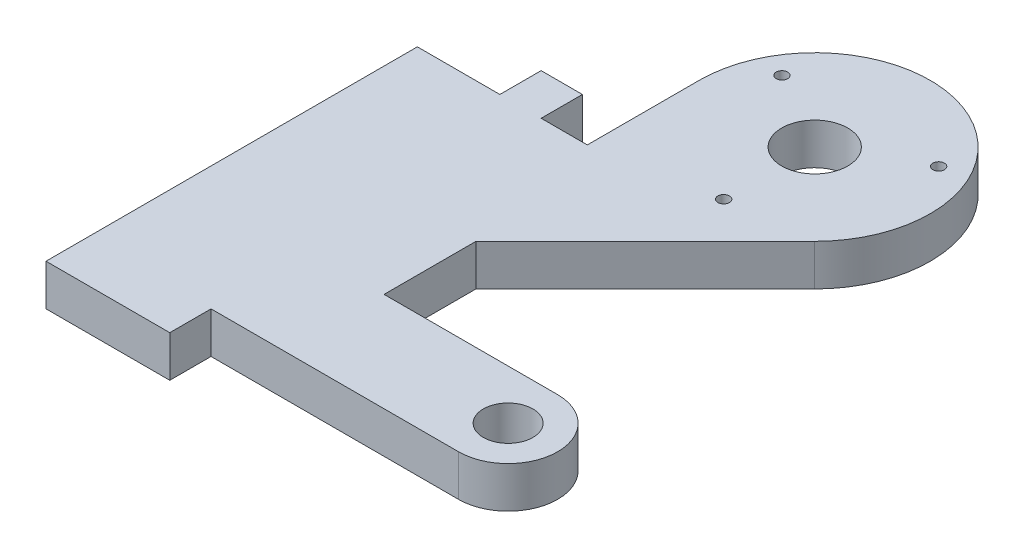
ISO-10303-21;
HEADER;
FILE_DESCRIPTION(('STEP AP214'),'2;1');
FILE_NAME('part.step','',(''),(''),'','','');
FILE_SCHEMA(('AUTOMOTIVE_DESIGN { 1 0 10303 214 1 1 1 1 }'));
ENDSEC;
DATA;
#1=APPLICATION_CONTEXT('core data for automotive mechanical design processes');
#2=APPLICATION_PROTOCOL_DEFINITION('international standard','automotive_design',2000,#1);
#3=PRODUCT_CONTEXT('',#1,'mechanical');
#4=PRODUCT('Part','Part','',(#3));
#5=PRODUCT_RELATED_PRODUCT_CATEGORY('part','',(#4));
#6=PRODUCT_DEFINITION_FORMATION('','',#4);
#7=PRODUCT_DEFINITION_CONTEXT('part definition',#1,'design');
#8=PRODUCT_DEFINITION('design','',#6,#7);
#9=PRODUCT_DEFINITION_SHAPE('','',#8);
#10=(LENGTH_UNIT() NAMED_UNIT(*) SI_UNIT(.MILLI.,.METRE.));
#11=(NAMED_UNIT(*) PLANE_ANGLE_UNIT() SI_UNIT($,.RADIAN.));
#12=(NAMED_UNIT(*) SI_UNIT($,.STERADIAN.) SOLID_ANGLE_UNIT());
#13=UNCERTAINTY_MEASURE_WITH_UNIT(LENGTH_MEASURE(1.E-05),#10,'distance_accuracy_value','');
#14=(GEOMETRIC_REPRESENTATION_CONTEXT(3) GLOBAL_UNCERTAINTY_ASSIGNED_CONTEXT((#13)) GLOBAL_UNIT_ASSIGNED_CONTEXT((#10,
#11,#12)) REPRESENTATION_CONTEXT('',''));
#15=CARTESIAN_POINT('',(0.,0.,0.));
#16=DIRECTION('',(0.,0.,1.));
#17=DIRECTION('',(1.,0.,0.));
#18=AXIS2_PLACEMENT_3D('',#15,#16,#17);
#19=CARTESIAN_POINT('',(34.5943867597462,5.,-53.5625469181819));
#20=DIRECTION('',(0.,-1.,0.));
#21=DIRECTION('',(0.,0.,-1.));
#22=AXIS2_PLACEMENT_3D('',#19,#20,#21);
#23=CYLINDRICAL_SURFACE('',#22,14.);
#24=CARTESIAN_POINT('',(34.5943867597462,0.,-53.5625469181819));
#25=DIRECTION('',(0.,1.,0.));
#26=DIRECTION('',(0.,0.,1.));
#27=AXIS2_PLACEMENT_3D('',#24,#25,#26);
#28=CIRCLE('',#27,14.);
#29=CARTESIAN_POINT('',(44.4938816963578,0.,-43.6630519815702));
#30=VERTEX_POINT('',#29);
#31=CARTESIAN_POINT('',(20.5943867597462,0.,-53.5625469181819));
#32=VERTEX_POINT('',#31);
#33=EDGE_CURVE('E207',#30,#32,#28,.T.);
#34=ORIENTED_EDGE('',*,*,#33,.T.);
#35=DIRECTION('',(0.,-1.,0.));
#36=VECTOR('',#35,1.);
#37=CARTESIAN_POINT('',(20.5943867597462,5.,-53.5625469181819));
#38=LINE('',#37,#36);
#39=CARTESIAN_POINT('',(20.5943867597462,5.,-53.5625469181819));
#40=VERTEX_POINT('',#39);
#41=EDGE_CURVE('E11',#40,#32,#38,.T.);
#42=ORIENTED_EDGE('',*,*,#41,.F.);
#43=CARTESIAN_POINT('',(34.5943867597462,5.,-53.5625469181819));
#44=DIRECTION('',(0.,1.,0.));
#45=DIRECTION('',(0.,0.,1.));
#46=AXIS2_PLACEMENT_3D('',#43,#44,#45);
#47=CIRCLE('',#46,14.);
#48=CARTESIAN_POINT('',(44.4938816963578,5.,-43.6630519815702));
#49=VERTEX_POINT('',#48);
#50=EDGE_CURVE('E353',#49,#40,#47,.T.);
#51=ORIENTED_EDGE('',*,*,#50,.F.);
#52=DIRECTION('',(0.,-1.,0.));
#53=VECTOR('',#52,1.);
#54=CARTESIAN_POINT('',(44.4938816963578,5.,-43.6630519815702));
#55=LINE('',#54,#53);
#56=EDGE_CURVE('E59',#49,#30,#55,.T.);
#57=ORIENTED_EDGE('',*,*,#56,.T.);
#58=EDGE_LOOP('',(#34,#42,#51,#57));
#59=FACE_BOUND('',#58,.T.);
#60=ADVANCED_FACE('F41',(#59),#23,.T.);
#61=CARTESIAN_POINT('',(20.5943867597462,5.,0.));
#62=DIRECTION('',(1.,0.,0.));
#63=DIRECTION('',(0.,0.,-1.));
#64=AXIS2_PLACEMENT_3D('',#61,#62,#63);
#65=PLANE('',#64);
#66=DIRECTION('',(0.,0.,1.));
#67=VECTOR('',#66,1.);
#68=CARTESIAN_POINT('',(20.5943867597462,0.,0.));
#69=LINE('',#68,#67);
#70=CARTESIAN_POINT('',(20.5943867597462,0.,-40.));
#71=VERTEX_POINT('',#70);
#72=EDGE_CURVE('E210',#32,#71,#69,.T.);
#73=ORIENTED_EDGE('',*,*,#72,.T.);
#74=DIRECTION('',(0.,-1.,0.));
#75=VECTOR('',#74,1.);
#76=CARTESIAN_POINT('',(20.5943867597462,5.,-40.));
#77=LINE('',#76,#75);
#78=CARTESIAN_POINT('',(20.5943867597462,5.,-40.));
#79=VERTEX_POINT('',#78);
#80=EDGE_CURVE('E51',#79,#71,#77,.T.);
#81=ORIENTED_EDGE('',*,*,#80,.F.);
#82=DIRECTION('',(0.,0.,1.));
#83=VECTOR('',#82,1.);
#84=CARTESIAN_POINT('',(20.5943867597462,5.,0.));
#85=LINE('',#84,#83);
#86=EDGE_CURVE('E119',#40,#79,#85,.T.);
#87=ORIENTED_EDGE('',*,*,#86,.F.);
#88=ORIENTED_EDGE('',*,*,#41,.T.);
#89=EDGE_LOOP('',(#73,#81,#87,#88));
#90=FACE_BOUND('',#89,.T.);
#91=ADVANCED_FACE('F303',(#90),#65,.F.);
#92=CARTESIAN_POINT('',(0.,5.,-40.));
#93=DIRECTION('',(0.,0.,-1.));
#94=DIRECTION('',(-1.,0.,0.));
#95=AXIS2_PLACEMENT_3D('',#92,#93,#94);
#96=PLANE('',#95);
#97=DIRECTION('',(1.,0.,0.));
#98=VECTOR('',#97,1.);
#99=CARTESIAN_POINT('',(0.,0.,-40.));
#100=LINE('',#99,#98);
#101=CARTESIAN_POINT('',(15.,0.,-40.));
#102=VERTEX_POINT('',#101);
#103=EDGE_CURVE('E214',#102,#71,#100,.T.);
#104=ORIENTED_EDGE('',*,*,#103,.F.);
#105=DIRECTION('',(0.,-1.,0.));
#106=VECTOR('',#105,1.);
#107=CARTESIAN_POINT('',(15.,5.,-40.));
#108=LINE('',#107,#106);
#109=CARTESIAN_POINT('',(15.,5.,-40.));
#110=VERTEX_POINT('',#109);
#111=EDGE_CURVE('E294',#110,#102,#108,.T.);
#112=ORIENTED_EDGE('',*,*,#111,.F.);
#113=DIRECTION('',(1.,0.,0.));
#114=VECTOR('',#113,1.);
#115=CARTESIAN_POINT('',(0.,5.,-40.));
#116=LINE('',#115,#114);
#117=EDGE_CURVE('E302',#110,#79,#116,.T.);
#118=ORIENTED_EDGE('',*,*,#117,.T.);
#119=ORIENTED_EDGE('',*,*,#80,.T.);
#120=EDGE_LOOP('',(#104,#112,#118,#119));
#121=FACE_BOUND('',#120,.T.);
#122=ADVANCED_FACE('F300',(#121),#96,.T.);
#123=CARTESIAN_POINT('',(15.,5.,0.));
#124=DIRECTION('',(-1.,0.,0.));
#125=DIRECTION('',(0.,0.,1.));
#126=AXIS2_PLACEMENT_3D('',#123,#124,#125);
#127=PLANE('',#126);
#128=DIRECTION('',(0.,0.,-1.));
#129=VECTOR('',#128,1.);
#130=CARTESIAN_POINT('',(15.,0.,0.));
#131=LINE('',#130,#129);
#132=CARTESIAN_POINT('',(15.,0.,-45.));
#133=VERTEX_POINT('',#132);
#134=EDGE_CURVE('E218',#102,#133,#131,.T.);
#135=ORIENTED_EDGE('',*,*,#134,.T.);
#136=DIRECTION('',(0.,-1.,0.));
#137=VECTOR('',#136,1.);
#138=CARTESIAN_POINT('',(15.,5.,-45.));
#139=LINE('',#138,#137);
#140=CARTESIAN_POINT('',(15.,5.,-45.));
#141=VERTEX_POINT('',#140);
#142=EDGE_CURVE('E290',#141,#133,#139,.T.);
#143=ORIENTED_EDGE('',*,*,#142,.F.);
#144=DIRECTION('',(0.,0.,-1.));
#145=VECTOR('',#144,1.);
#146=CARTESIAN_POINT('',(15.,5.,0.));
#147=LINE('',#146,#145);
#148=EDGE_CURVE('E323',#110,#141,#147,.T.);
#149=ORIENTED_EDGE('',*,*,#148,.F.);
#150=ORIENTED_EDGE('',*,*,#111,.T.);
#151=EDGE_LOOP('',(#135,#143,#149,#150));
#152=FACE_BOUND('',#151,.T.);
#153=ADVANCED_FACE('F312',(#152),#127,.F.);
#154=CARTESIAN_POINT('',(0.,5.,-45.));
#155=DIRECTION('',(0.,0.,1.));
#156=DIRECTION('',(1.,0.,0.));
#157=AXIS2_PLACEMENT_3D('',#154,#155,#156);
#158=PLANE('',#157);
#159=DIRECTION('',(-1.,0.,0.));
#160=VECTOR('',#159,1.);
#161=CARTESIAN_POINT('',(0.,0.,-45.));
#162=LINE('',#161,#160);
#163=CARTESIAN_POINT('',(9.99999999999999,0.,-45.));
#164=VERTEX_POINT('',#163);
#165=EDGE_CURVE('E222',#133,#164,#162,.T.);
#166=ORIENTED_EDGE('',*,*,#165,.T.);
#167=DIRECTION('',(0.,-1.,0.));
#168=VECTOR('',#167,1.);
#169=CARTESIAN_POINT('',(9.99999999999999,5.,-45.));
#170=LINE('',#169,#168);
#171=CARTESIAN_POINT('',(9.99999999999999,5.,-45.));
#172=VERTEX_POINT('',#171);
#173=EDGE_CURVE('E287',#172,#164,#170,.T.);
#174=ORIENTED_EDGE('',*,*,#173,.F.);
#175=DIRECTION('',(-1.,0.,0.));
#176=VECTOR('',#175,1.);
#177=CARTESIAN_POINT('',(0.,5.,-45.));
#178=LINE('',#177,#176);
#179=EDGE_CURVE('E318',#141,#172,#178,.T.);
#180=ORIENTED_EDGE('',*,*,#179,.F.);
#181=ORIENTED_EDGE('',*,*,#142,.T.);
#182=EDGE_LOOP('',(#166,#174,#180,#181));
#183=FACE_BOUND('',#182,.T.);
#184=ADVANCED_FACE('F316',(#183),#158,.F.);
#185=CARTESIAN_POINT('',(10.,5.,0.));
#186=DIRECTION('',(-1.,0.,0.));
#187=DIRECTION('',(0.,0.,1.));
#188=AXIS2_PLACEMENT_3D('',#185,#186,#187);
#189=PLANE('',#188);
#190=DIRECTION('',(0.,0.,-1.));
#191=VECTOR('',#190,1.);
#192=CARTESIAN_POINT('',(10.,0.,0.));
#193=LINE('',#192,#191);
#194=CARTESIAN_POINT('',(10.,0.,-40.));
#195=VERTEX_POINT('',#194);
#196=EDGE_CURVE('E226',#195,#164,#193,.T.);
#197=ORIENTED_EDGE('',*,*,#196,.F.);
#198=DIRECTION('',(0.,-1.,0.));
#199=VECTOR('',#198,1.);
#200=CARTESIAN_POINT('',(10.,5.,-40.));
#201=LINE('',#200,#199);
#202=CARTESIAN_POINT('',(10.,5.,-40.));
#203=VERTEX_POINT('',#202);
#204=EDGE_CURVE('E284',#203,#195,#201,.T.);
#205=ORIENTED_EDGE('',*,*,#204,.F.);
#206=DIRECTION('',(0.,0.,-1.));
#207=VECTOR('',#206,1.);
#208=CARTESIAN_POINT('',(10.,5.,0.));
#209=LINE('',#208,#207);
#210=EDGE_CURVE('E322',#203,#172,#209,.T.);
#211=ORIENTED_EDGE('',*,*,#210,.T.);
#212=ORIENTED_EDGE('',*,*,#173,.T.);
#213=EDGE_LOOP('',(#197,#205,#211,#212));
#214=FACE_BOUND('',#213,.T.);
#215=ADVANCED_FACE('F458',(#214),#189,.T.);
#216=CARTESIAN_POINT('',(0.,0.,-40.));
#217=VERTEX_POINT('',#216);
#218=EDGE_CURVE('E219',#217,#195,#100,.T.);
#219=ORIENTED_EDGE('',*,*,#218,.F.);
#220=DIRECTION('',(0.,-1.,0.));
#221=VECTOR('',#220,1.);
#222=CARTESIAN_POINT('',(0.,5.,-40.));
#223=LINE('',#222,#221);
#224=CARTESIAN_POINT('',(0.,5.,-40.));
#225=VERTEX_POINT('',#224);
#226=EDGE_CURVE('E281',#225,#217,#223,.T.);
#227=ORIENTED_EDGE('',*,*,#226,.F.);
#228=EDGE_CURVE('E327',#225,#203,#116,.T.);
#229=ORIENTED_EDGE('',*,*,#228,.T.);
#230=ORIENTED_EDGE('',*,*,#204,.T.);
#231=EDGE_LOOP('',(#219,#227,#229,#230));
#232=FACE_BOUND('',#231,.T.);
#233=ADVANCED_FACE('F454',(#232),#96,.T.);
#234=CARTESIAN_POINT('',(0.,5.,0.));
#235=DIRECTION('',(-1.,0.,0.));
#236=DIRECTION('',(0.,0.,1.));
#237=AXIS2_PLACEMENT_3D('',#234,#235,#236);
#238=PLANE('',#237);
#239=DIRECTION('',(0.,0.,-1.));
#240=VECTOR('',#239,1.);
#241=CARTESIAN_POINT('',(0.,0.,0.));
#242=LINE('',#241,#240);
#243=CARTESIAN_POINT('',(0.,0.,5.));
#244=VERTEX_POINT('',#243);
#245=EDGE_CURVE('E230',#244,#217,#242,.T.);
#246=ORIENTED_EDGE('',*,*,#245,.F.);
#247=DIRECTION('',(0.,-1.,0.));
#248=VECTOR('',#247,1.);
#249=CARTESIAN_POINT('',(0.,5.,5.));
#250=LINE('',#249,#248);
#251=CARTESIAN_POINT('',(0.,5.,5.));
#252=VERTEX_POINT('',#251);
#253=EDGE_CURVE('E278',#252,#244,#250,.T.);
#254=ORIENTED_EDGE('',*,*,#253,.F.);
#255=DIRECTION('',(0.,0.,-1.));
#256=VECTOR('',#255,1.);
#257=CARTESIAN_POINT('',(0.,5.,0.));
#258=LINE('',#257,#256);
#259=EDGE_CURVE('E332',#252,#225,#258,.T.);
#260=ORIENTED_EDGE('',*,*,#259,.T.);
#261=ORIENTED_EDGE('',*,*,#226,.T.);
#262=EDGE_LOOP('',(#246,#254,#260,#261));
#263=FACE_BOUND('',#262,.T.);
#264=ADVANCED_FACE('F450',(#263),#238,.T.);
#265=CARTESIAN_POINT('',(0.,5.,5.));
#266=DIRECTION('',(0.,0.,-1.));
#267=DIRECTION('',(-1.,0.,0.));
#268=AXIS2_PLACEMENT_3D('',#265,#266,#267);
#269=PLANE('',#268);
#270=DIRECTION('',(1.,0.,0.));
#271=VECTOR('',#270,1.);
#272=CARTESIAN_POINT('',(0.,0.,5.));
#273=LINE('',#272,#271);
#274=CARTESIAN_POINT('',(15.,0.,5.));
#275=VERTEX_POINT('',#274);
#276=EDGE_CURVE('E234',#244,#275,#273,.T.);
#277=ORIENTED_EDGE('',*,*,#276,.T.);
#278=DIRECTION('',(0.,-1.,0.));
#279=VECTOR('',#278,1.);
#280=CARTESIAN_POINT('',(15.,5.,5.));
#281=LINE('',#280,#279);
#282=CARTESIAN_POINT('',(15.,5.,5.));
#283=VERTEX_POINT('',#282);
#284=EDGE_CURVE('E275',#283,#275,#281,.T.);
#285=ORIENTED_EDGE('',*,*,#284,.F.);
#286=DIRECTION('',(1.,0.,0.));
#287=VECTOR('',#286,1.);
#288=CARTESIAN_POINT('',(0.,5.,5.));
#289=LINE('',#288,#287);
#290=EDGE_CURVE('E336',#252,#283,#289,.T.);
#291=ORIENTED_EDGE('',*,*,#290,.F.);
#292=ORIENTED_EDGE('',*,*,#253,.T.);
#293=EDGE_LOOP('',(#277,#285,#291,#292));
#294=FACE_BOUND('',#293,.T.);
#295=ADVANCED_FACE('F446',(#294),#269,.F.);
#296=CARTESIAN_POINT('',(15.,5.,0.));
#297=DIRECTION('',(1.,0.,0.));
#298=DIRECTION('',(0.,0.,-1.));
#299=AXIS2_PLACEMENT_3D('',#296,#297,#298);
#300=PLANE('',#299);
#301=DIRECTION('',(0.,0.,1.));
#302=VECTOR('',#301,1.);
#303=CARTESIAN_POINT('',(15.,0.,0.));
#304=LINE('',#303,#302);
#305=CARTESIAN_POINT('',(15.,0.,0.));
#306=VERTEX_POINT('',#305);
#307=EDGE_CURVE('E238',#306,#275,#304,.T.);
#308=ORIENTED_EDGE('',*,*,#307,.F.);
#309=DIRECTION('',(0.,-1.,0.));
#310=VECTOR('',#309,1.);
#311=CARTESIAN_POINT('',(15.,5.,0.));
#312=LINE('',#311,#310);
#313=CARTESIAN_POINT('',(15.,5.,0.));
#314=VERTEX_POINT('',#313);
#315=EDGE_CURVE('E272',#314,#306,#312,.T.);
#316=ORIENTED_EDGE('',*,*,#315,.F.);
#317=DIRECTION('',(0.,0.,1.));
#318=VECTOR('',#317,1.);
#319=CARTESIAN_POINT('',(15.,5.,0.));
#320=LINE('',#319,#318);
#321=EDGE_CURVE('E339',#314,#283,#320,.T.);
#322=ORIENTED_EDGE('',*,*,#321,.T.);
#323=ORIENTED_EDGE('',*,*,#284,.T.);
#324=EDGE_LOOP('',(#308,#316,#322,#323));
#325=FACE_BOUND('',#324,.T.);
#326=ADVANCED_FACE('F442',(#325),#300,.T.);
#327=CARTESIAN_POINT('',(0.,5.,0.));
#328=DIRECTION('',(0.,0.,-1.));
#329=DIRECTION('',(-1.,0.,0.));
#330=AXIS2_PLACEMENT_3D('',#327,#328,#329);
#331=PLANE('',#330);
#332=DIRECTION('',(1.,0.,0.));
#333=VECTOR('',#332,1.);
#334=CARTESIAN_POINT('',(0.,0.,0.));
#335=LINE('',#334,#333);
#336=CARTESIAN_POINT('',(45.,0.,0.));
#337=VERTEX_POINT('',#336);
#338=EDGE_CURVE('E242',#306,#337,#335,.T.);
#339=ORIENTED_EDGE('',*,*,#338,.T.);
#340=DIRECTION('',(0.,-1.,0.));
#341=VECTOR('',#340,1.);
#342=CARTESIAN_POINT('',(45.,5.,0.));
#343=LINE('',#342,#341);
#344=CARTESIAN_POINT('',(45.,5.,0.));
#345=VERTEX_POINT('',#344);
#346=EDGE_CURVE('E268',#345,#337,#343,.T.);
#347=ORIENTED_EDGE('',*,*,#346,.F.);
#348=DIRECTION('',(1.,0.,0.));
#349=VECTOR('',#348,1.);
#350=CARTESIAN_POINT('',(0.,5.,0.));
#351=LINE('',#350,#349);
#352=EDGE_CURVE('E343',#314,#345,#351,.T.);
#353=ORIENTED_EDGE('',*,*,#352,.F.);
#354=ORIENTED_EDGE('',*,*,#315,.T.);
#355=EDGE_LOOP('',(#339,#347,#353,#354));
#356=FACE_BOUND('',#355,.T.);
#357=ADVANCED_FACE('F438',(#356),#331,.F.);
#358=CARTESIAN_POINT('',(45.,5.,-6.));
#359=DIRECTION('',(0.,-1.,0.));
#360=DIRECTION('',(0.,0.,-1.));
#361=AXIS2_PLACEMENT_3D('',#358,#359,#360);
#362=CYLINDRICAL_SURFACE('',#361,6.);
#363=CARTESIAN_POINT('',(45.,0.,-6.));
#364=DIRECTION('',(0.,1.,0.));
#365=DIRECTION('',(0.,0.,1.));
#366=AXIS2_PLACEMENT_3D('',#363,#364,#365);
#367=CIRCLE('',#366,6.);
#368=CARTESIAN_POINT('',(45.,0.,-12.));
#369=VERTEX_POINT('',#368);
#370=EDGE_CURVE('E245',#337,#369,#367,.T.);
#371=ORIENTED_EDGE('',*,*,#370,.T.);
#372=DIRECTION('',(0.,-1.,0.));
#373=VECTOR('',#372,1.);
#374=CARTESIAN_POINT('',(45.,5.,-12.));
#375=LINE('',#374,#373);
#376=CARTESIAN_POINT('',(45.,5.,-12.));
#377=VERTEX_POINT('',#376);
#378=EDGE_CURVE('E177',#377,#369,#375,.T.);
#379=ORIENTED_EDGE('',*,*,#378,.F.);
#380=CARTESIAN_POINT('',(45.,5.,-6.));
#381=DIRECTION('',(0.,1.,0.));
#382=DIRECTION('',(0.,0.,1.));
#383=AXIS2_PLACEMENT_3D('',#380,#381,#382);
#384=CIRCLE('',#383,6.);
#385=EDGE_CURVE('E163',#345,#377,#384,.T.);
#386=ORIENTED_EDGE('',*,*,#385,.F.);
#387=ORIENTED_EDGE('',*,*,#346,.T.);
#388=EDGE_LOOP('',(#371,#379,#386,#387));
#389=FACE_BOUND('',#388,.T.);
#390=ADVANCED_FACE('F435',(#389),#362,.T.);
#391=CARTESIAN_POINT('',(0.,5.,-12.));
#392=DIRECTION('',(0.,0.,1.));
#393=DIRECTION('',(1.,0.,0.));
#394=AXIS2_PLACEMENT_3D('',#391,#392,#393);
#395=PLANE('',#394);
#396=DIRECTION('',(-1.,0.,0.));
#397=VECTOR('',#396,1.);
#398=CARTESIAN_POINT('',(0.,0.,-12.));
#399=LINE('',#398,#397);
#400=CARTESIAN_POINT('',(23.9647394168679,0.,-12.));
#401=VERTEX_POINT('',#400);
#402=EDGE_CURVE('E173',#369,#401,#399,.T.);
#403=ORIENTED_EDGE('',*,*,#402,.T.);
#404=DIRECTION('',(0.,-1.,0.));
#405=VECTOR('',#404,1.);
#406=CARTESIAN_POINT('',(23.9647394168679,5.,-12.));
#407=LINE('',#406,#405);
#408=CARTESIAN_POINT('',(23.9647394168679,5.,-12.));
#409=VERTEX_POINT('',#408);
#410=EDGE_CURVE('E170',#409,#401,#407,.T.);
#411=ORIENTED_EDGE('',*,*,#410,.F.);
#412=DIRECTION('',(-1.,0.,0.));
#413=VECTOR('',#412,1.);
#414=CARTESIAN_POINT('',(0.,5.,-12.));
#415=LINE('',#414,#413);
#416=EDGE_CURVE('E155',#377,#409,#415,.T.);
#417=ORIENTED_EDGE('',*,*,#416,.F.);
#418=ORIENTED_EDGE('',*,*,#378,.T.);
#419=EDGE_LOOP('',(#403,#411,#417,#418));
#420=FACE_BOUND('',#419,.T.);
#421=ADVANCED_FACE('F171',(#420),#395,.F.);
#422=CARTESIAN_POINT('',(23.9647394168679,5.,0.));
#423=DIRECTION('',(-1.,0.,0.));
#424=DIRECTION('',(0.,0.,1.));
#425=AXIS2_PLACEMENT_3D('',#422,#423,#424);
#426=PLANE('',#425);
#427=DIRECTION('',(0.,0.,-1.));
#428=VECTOR('',#427,1.);
#429=CARTESIAN_POINT('',(23.9647394168679,0.,0.));
#430=LINE('',#429,#428);
#431=CARTESIAN_POINT('',(23.9647394168679,0.,-23.1339097020804));
#432=VERTEX_POINT('',#431);
#433=EDGE_CURVE('E250',#401,#432,#430,.T.);
#434=ORIENTED_EDGE('',*,*,#433,.T.);
#435=DIRECTION('',(0.,-1.,0.));
#436=VECTOR('',#435,1.);
#437=CARTESIAN_POINT('',(23.9647394168679,5.,-23.1339097020804));
#438=LINE('',#437,#436);
#439=CARTESIAN_POINT('',(23.9647394168679,5.,-23.1339097020804));
#440=VERTEX_POINT('',#439);
#441=EDGE_CURVE('E107',#440,#432,#438,.T.);
#442=ORIENTED_EDGE('',*,*,#441,.F.);
#443=DIRECTION('',(0.,0.,-1.));
#444=VECTOR('',#443,1.);
#445=CARTESIAN_POINT('',(23.9647394168679,5.,0.));
#446=LINE('',#445,#444);
#447=EDGE_CURVE('E161',#409,#440,#446,.T.);
#448=ORIENTED_EDGE('',*,*,#447,.F.);
#449=ORIENTED_EDGE('',*,*,#410,.T.);
#450=EDGE_LOOP('',(#434,#442,#448,#449));
#451=FACE_BOUND('',#450,.T.);
#452=ADVANCED_FACE('F179',(#451),#426,.F.);
#453=CARTESIAN_POINT('',(0.415414857393735,5.,0.415414857393736));
#454=DIRECTION('',(0.707106781186546,0.,0.707106781186549));
#455=DIRECTION('',(0.707106781186549,0.,-0.707106781186546));
#456=AXIS2_PLACEMENT_3D('',#453,#454,#455);
#457=PLANE('',#456);
#458=DIRECTION('',(-0.707106781186549,0.,0.707106781186546));
#459=VECTOR('',#458,1.);
#460=CARTESIAN_POINT('',(0.415414857393735,0.,0.415414857393736));
#461=LINE('',#460,#459);
#462=EDGE_CURVE('E253',#30,#432,#461,.T.);
#463=ORIENTED_EDGE('',*,*,#462,.F.);
#464=ORIENTED_EDGE('',*,*,#56,.F.);
#465=DIRECTION('',(-0.707106781186549,0.,0.707106781186546));
#466=VECTOR('',#465,1.);
#467=CARTESIAN_POINT('',(0.415414857393735,5.,0.415414857393736));
#468=LINE('',#467,#466);
#469=EDGE_CURVE('E181',#49,#440,#468,.T.);
#470=ORIENTED_EDGE('',*,*,#469,.T.);
#471=ORIENTED_EDGE('',*,*,#441,.T.);
#472=EDGE_LOOP('',(#463,#464,#470,#471));
#473=FACE_BOUND('',#472,.T.);
#474=ADVANCED_FACE('F389',(#473),#457,.T.);
#475=CARTESIAN_POINT('',(44.1390993033221,5.,-59.0304955701449));
#476=DIRECTION('',(0.,-1.,0.));
#477=DIRECTION('',(0.,0.,-1.));
#478=AXIS2_PLACEMENT_3D('',#475,#476,#477);
#479=CYLINDRICAL_SURFACE('',#478,0.700000000000006);
#480=CARTESIAN_POINT('',(44.1390993033221,5.,-59.0304955701449));
#481=DIRECTION('',(0.,1.,0.));
#482=DIRECTION('',(0.,0.,1.));
#483=AXIS2_PLACEMENT_3D('',#480,#481,#482);
#484=CIRCLE('',#483,0.700000000000006);
#485=CARTESIAN_POINT('',(44.1390993033221,5.,-58.3304955701449));
#486=VERTEX_POINT('',#485);
#487=EDGE_CURVE('E355',#486,#486,#484,.T.);
#488=ORIENTED_EDGE('',*,*,#487,.T.);
#489=EDGE_LOOP('',(#488));
#490=FACE_BOUND('',#489,.T.);
#491=CARTESIAN_POINT('',(44.1390993033221,0.,-59.0304955701449));
#492=DIRECTION('',(0.,1.,0.));
#493=DIRECTION('',(0.,0.,1.));
#494=AXIS2_PLACEMENT_3D('',#491,#492,#493);
#495=CIRCLE('',#494,0.700000000000006);
#496=CARTESIAN_POINT('',(44.1390993033221,0.,-58.3304955701449));
#497=VERTEX_POINT('',#496);
#498=EDGE_CURVE('E203',#497,#497,#495,.T.);
#499=ORIENTED_EDGE('',*,*,#498,.F.);
#500=EDGE_LOOP('',(#499));
#501=FACE_BOUND('',#500,.T.);
#502=ADVANCED_FACE('F385',(#490,#501),#479,.F.);
#503=CARTESIAN_POINT('',(25.0866480487693,5.,-59.0945361267571));
#504=DIRECTION('',(0.,-1.,0.));
#505=DIRECTION('',(0.,0.,-1.));
#506=AXIS2_PLACEMENT_3D('',#503,#504,#505);
#507=CYLINDRICAL_SURFACE('',#506,0.700000000000004);
#508=CARTESIAN_POINT('',(25.0866480487693,5.,-59.0945361267571));
#509=DIRECTION('',(0.,1.,0.));
#510=DIRECTION('',(0.,0.,1.));
#511=AXIS2_PLACEMENT_3D('',#508,#509,#510);
#512=CIRCLE('',#511,0.700000000000004);
#513=CARTESIAN_POINT('',(25.0866480487693,5.,-58.3945361267571));
#514=VERTEX_POINT('',#513);
#515=EDGE_CURVE('E361',#514,#514,#512,.T.);
#516=ORIENTED_EDGE('',*,*,#515,.T.);
#517=EDGE_LOOP('',(#516));
#518=FACE_BOUND('',#517,.T.);
#519=CARTESIAN_POINT('',(25.0866480487693,0.,-59.0945361267571));
#520=DIRECTION('',(0.,1.,0.));
#521=DIRECTION('',(0.,0.,1.));
#522=AXIS2_PLACEMENT_3D('',#519,#520,#521);
#523=CIRCLE('',#522,0.700000000000004);
#524=CARTESIAN_POINT('',(25.0866480487693,0.,-58.3945361267571));
#525=VERTEX_POINT('',#524);
#526=EDGE_CURVE('E199',#525,#525,#523,.T.);
#527=ORIENTED_EDGE('',*,*,#526,.F.);
#528=EDGE_LOOP('',(#527));
#529=FACE_BOUND('',#528,.T.);
#530=ADVANCED_FACE('F388',(#518,#529),#507,.F.);
#531=CARTESIAN_POINT('',(34.5574129271471,5.,-42.5626090576436));
#532=DIRECTION('',(0.,-1.,0.));
#533=DIRECTION('',(0.,0.,-1.));
#534=AXIS2_PLACEMENT_3D('',#531,#532,#533);
#535=CYLINDRICAL_SURFACE('',#534,0.700000000000001);
#536=CARTESIAN_POINT('',(34.5574129271471,5.,-42.5626090576436));
#537=DIRECTION('',(0.,1.,0.));
#538=DIRECTION('',(0.,0.,1.));
#539=AXIS2_PLACEMENT_3D('',#536,#537,#538);
#540=CIRCLE('',#539,0.700000000000001);
#541=CARTESIAN_POINT('',(34.5574129271471,5.,-41.8626090576436));
#542=VERTEX_POINT('',#541);
#543=EDGE_CURVE('E365',#542,#542,#540,.T.);
#544=ORIENTED_EDGE('',*,*,#543,.T.);
#545=EDGE_LOOP('',(#544));
#546=FACE_BOUND('',#545,.T.);
#547=CARTESIAN_POINT('',(34.5574129271471,0.,-42.5626090576436));
#548=DIRECTION('',(0.,1.,0.));
#549=DIRECTION('',(0.,0.,1.));
#550=AXIS2_PLACEMENT_3D('',#547,#548,#549);
#551=CIRCLE('',#550,0.700000000000001);
#552=CARTESIAN_POINT('',(34.5574129271471,0.,-41.8626090576436));
#553=VERTEX_POINT('',#552);
#554=EDGE_CURVE('E195',#553,#553,#551,.T.);
#555=ORIENTED_EDGE('',*,*,#554,.F.);
#556=EDGE_LOOP('',(#555));
#557=FACE_BOUND('',#556,.T.);
#558=ADVANCED_FACE('F409',(#546,#557),#535,.F.);
#559=CARTESIAN_POINT('',(34.5943867597462,5.,-53.5625469181819));
#560=DIRECTION('',(0.,-1.,0.));
#561=DIRECTION('',(0.,0.,-1.));
#562=AXIS2_PLACEMENT_3D('',#559,#560,#561);
#563=CYLINDRICAL_SURFACE('',#562,4.);
#564=CARTESIAN_POINT('',(34.5943867597462,5.,-53.5625469181819));
#565=DIRECTION('',(0.,1.,0.));
#566=DIRECTION('',(0.,0.,1.));
#567=AXIS2_PLACEMENT_3D('',#564,#565,#566);
#568=CIRCLE('',#567,4.);
#569=CARTESIAN_POINT('',(34.5943867597462,5.,-49.5625469181819));
#570=VERTEX_POINT('',#569);
#571=EDGE_CURVE('E261',#570,#570,#568,.T.);
#572=ORIENTED_EDGE('',*,*,#571,.T.);
#573=EDGE_LOOP('',(#572));
#574=FACE_BOUND('',#573,.T.);
#575=CARTESIAN_POINT('',(34.5943867597462,0.,-53.5625469181819));
#576=DIRECTION('',(0.,1.,0.));
#577=DIRECTION('',(0.,0.,1.));
#578=AXIS2_PLACEMENT_3D('',#575,#576,#577);
#579=CIRCLE('',#578,4.);
#580=CARTESIAN_POINT('',(34.5943867597462,0.,-49.5625469181819));
#581=VERTEX_POINT('',#580);
#582=EDGE_CURVE('E191',#581,#581,#579,.T.);
#583=ORIENTED_EDGE('',*,*,#582,.F.);
#584=EDGE_LOOP('',(#583));
#585=FACE_BOUND('',#584,.T.);
#586=ADVANCED_FACE('F43',(#574,#585),#563,.F.);
#587=CARTESIAN_POINT('',(45.,5.,-6.));
#588=DIRECTION('',(0.,-1.,0.));
#589=DIRECTION('',(0.,0.,-1.));
#590=AXIS2_PLACEMENT_3D('',#587,#588,#589);
#591=CYLINDRICAL_SURFACE('',#590,3.);
#592=CARTESIAN_POINT('',(45.,5.,-6.));
#593=DIRECTION('',(0.,1.,0.));
#594=DIRECTION('',(0.,0.,1.));
#595=AXIS2_PLACEMENT_3D('',#592,#593,#594);
#596=CIRCLE('',#595,3.);
#597=CARTESIAN_POINT('',(45.,5.,-3.));
#598=VERTEX_POINT('',#597);
#599=EDGE_CURVE('E184',#598,#598,#596,.T.);
#600=ORIENTED_EDGE('',*,*,#599,.T.);
#601=EDGE_LOOP('',(#600));
#602=FACE_BOUND('',#601,.T.);
#603=CARTESIAN_POINT('',(45.,0.,-6.));
#604=DIRECTION('',(0.,1.,0.));
#605=DIRECTION('',(0.,0.,1.));
#606=AXIS2_PLACEMENT_3D('',#603,#604,#605);
#607=CIRCLE('',#606,3.);
#608=CARTESIAN_POINT('',(45.,0.,-3.));
#609=VERTEX_POINT('',#608);
#610=EDGE_CURVE('E257',#609,#609,#607,.T.);
#611=ORIENTED_EDGE('',*,*,#610,.F.);
#612=EDGE_LOOP('',(#611));
#613=FACE_BOUND('',#612,.T.);
#614=ADVANCED_FACE('F377',(#602,#613),#591,.F.);
#615=CARTESIAN_POINT('',(0.,5.,0.));
#616=DIRECTION('',(0.,1.,0.));
#617=DIRECTION('',(0.,0.,1.));
#618=AXIS2_PLACEMENT_3D('',#615,#616,#617);
#619=PLANE('',#618);
#620=ORIENTED_EDGE('',*,*,#571,.F.);
#621=EDGE_LOOP('',(#620));
#622=FACE_BOUND('',#621,.T.);
#623=ORIENTED_EDGE('',*,*,#543,.F.);
#624=EDGE_LOOP('',(#623));
#625=FACE_BOUND('',#624,.T.);
#626=ORIENTED_EDGE('',*,*,#515,.F.);
#627=EDGE_LOOP('',(#626));
#628=FACE_BOUND('',#627,.T.);
#629=ORIENTED_EDGE('',*,*,#487,.F.);
#630=EDGE_LOOP('',(#629));
#631=FACE_BOUND('',#630,.T.);
#632=ORIENTED_EDGE('',*,*,#50,.T.);
#633=ORIENTED_EDGE('',*,*,#86,.T.);
#634=ORIENTED_EDGE('',*,*,#117,.F.);
#635=ORIENTED_EDGE('',*,*,#148,.T.);
#636=ORIENTED_EDGE('',*,*,#179,.T.);
#637=ORIENTED_EDGE('',*,*,#210,.F.);
#638=ORIENTED_EDGE('',*,*,#228,.F.);
#639=ORIENTED_EDGE('',*,*,#259,.F.);
#640=ORIENTED_EDGE('',*,*,#290,.T.);
#641=ORIENTED_EDGE('',*,*,#321,.F.);
#642=ORIENTED_EDGE('',*,*,#352,.T.);
#643=ORIENTED_EDGE('',*,*,#385,.T.);
#644=ORIENTED_EDGE('',*,*,#416,.T.);
#645=ORIENTED_EDGE('',*,*,#447,.T.);
#646=ORIENTED_EDGE('',*,*,#469,.F.);
#647=EDGE_LOOP('',(#632,#633,#634,#635,#636,#637,#638,#639,#640,#641,#642,#643,#644,#645,#646));
#648=FACE_BOUND('',#647,.T.);
#649=ORIENTED_EDGE('',*,*,#599,.F.);
#650=EDGE_LOOP('',(#649));
#651=FACE_BOUND('',#650,.T.);
#652=ADVANCED_FACE('F157',(#622,#625,#628,#631,#648,#651),#619,.T.);
#653=CARTESIAN_POINT('',(0.,0.,0.));
#654=DIRECTION('',(0.,1.,0.));
#655=DIRECTION('',(0.,0.,1.));
#656=AXIS2_PLACEMENT_3D('',#653,#654,#655);
#657=PLANE('',#656);
#658=ORIENTED_EDGE('',*,*,#582,.T.);
#659=EDGE_LOOP('',(#658));
#660=FACE_BOUND('',#659,.T.);
#661=ORIENTED_EDGE('',*,*,#554,.T.);
#662=EDGE_LOOP('',(#661));
#663=FACE_BOUND('',#662,.T.);
#664=ORIENTED_EDGE('',*,*,#526,.T.);
#665=EDGE_LOOP('',(#664));
#666=FACE_BOUND('',#665,.T.);
#667=ORIENTED_EDGE('',*,*,#498,.T.);
#668=EDGE_LOOP('',(#667));
#669=FACE_BOUND('',#668,.T.);
#670=ORIENTED_EDGE('',*,*,#33,.F.);
#671=ORIENTED_EDGE('',*,*,#462,.T.);
#672=ORIENTED_EDGE('',*,*,#433,.F.);
#673=ORIENTED_EDGE('',*,*,#402,.F.);
#674=ORIENTED_EDGE('',*,*,#370,.F.);
#675=ORIENTED_EDGE('',*,*,#338,.F.);
#676=ORIENTED_EDGE('',*,*,#307,.T.);
#677=ORIENTED_EDGE('',*,*,#276,.F.);
#678=ORIENTED_EDGE('',*,*,#245,.T.);
#679=ORIENTED_EDGE('',*,*,#218,.T.);
#680=ORIENTED_EDGE('',*,*,#196,.T.);
#681=ORIENTED_EDGE('',*,*,#165,.F.);
#682=ORIENTED_EDGE('',*,*,#134,.F.);
#683=ORIENTED_EDGE('',*,*,#103,.T.);
#684=ORIENTED_EDGE('',*,*,#72,.F.);
#685=EDGE_LOOP('',(#670,#671,#672,#673,#674,#675,#676,#677,#678,#679,#680,#681,#682,#683,#684));
#686=FACE_BOUND('',#685,.T.);
#687=ORIENTED_EDGE('',*,*,#610,.T.);
#688=EDGE_LOOP('',(#687));
#689=FACE_BOUND('',#688,.T.);
#690=ADVANCED_FACE('F307',(#660,#663,#666,#669,#686,#689),#657,.F.);
#691=CLOSED_SHELL('',(#60,#91,#122,#153,#184,#215,#233,#264,#295,#326,#357,#390,#421,#452,#474,
#502,#530,#558,#586,#614,#652,#690));
#692=MANIFOLD_SOLID_BREP('B2',#691);
#693=ADVANCED_BREP_SHAPE_REPRESENTATION('',(#18,#692),#14);
#694=SHAPE_DEFINITION_REPRESENTATION(#9,#693);
ENDSEC;
END-ISO-10303-21;
